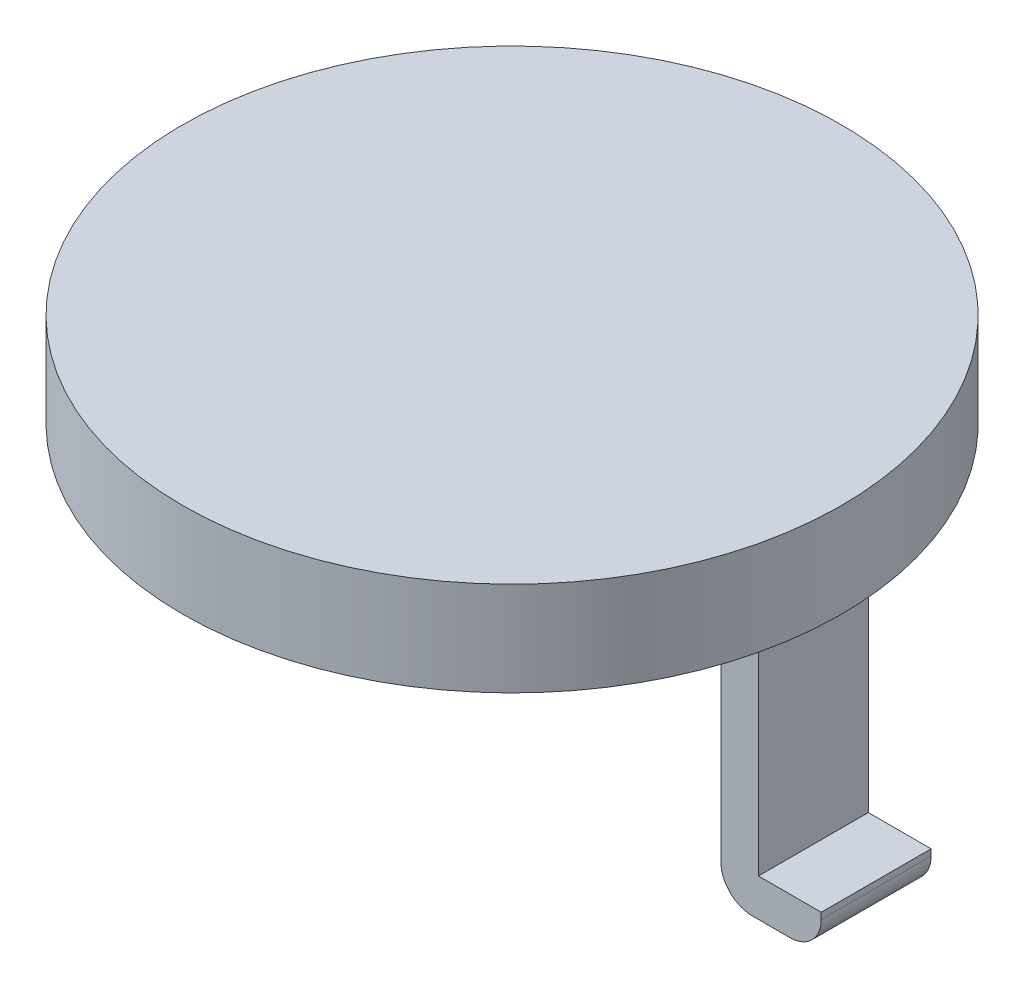
ISO-10303-21;
HEADER;
FILE_DESCRIPTION(('STEP AP214'),'2;1');
FILE_NAME('part.step','',(''),(''),'','','');
FILE_SCHEMA(('AUTOMOTIVE_DESIGN { 1 0 10303 214 1 1 1 1 }'));
ENDSEC;
DATA;
#1=APPLICATION_CONTEXT('core data for automotive mechanical design processes');
#2=APPLICATION_PROTOCOL_DEFINITION('international standard','automotive_design',2000,#1);
#3=PRODUCT_CONTEXT('',#1,'mechanical');
#4=PRODUCT('Part','Part','',(#3));
#5=PRODUCT_RELATED_PRODUCT_CATEGORY('part','',(#4));
#6=PRODUCT_DEFINITION_FORMATION('','',#4);
#7=PRODUCT_DEFINITION_CONTEXT('part definition',#1,'design');
#8=PRODUCT_DEFINITION('design','',#6,#7);
#9=PRODUCT_DEFINITION_SHAPE('','',#8);
#10=(LENGTH_UNIT() NAMED_UNIT(*) SI_UNIT(.MILLI.,.METRE.));
#11=(NAMED_UNIT(*) PLANE_ANGLE_UNIT() SI_UNIT($,.RADIAN.));
#12=(NAMED_UNIT(*) SI_UNIT($,.STERADIAN.) SOLID_ANGLE_UNIT());
#13=UNCERTAINTY_MEASURE_WITH_UNIT(LENGTH_MEASURE(1.E-05),#10,'distance_accuracy_value','');
#14=(GEOMETRIC_REPRESENTATION_CONTEXT(3) GLOBAL_UNCERTAINTY_ASSIGNED_CONTEXT((#13)) GLOBAL_UNIT_ASSIGNED_CONTEXT((#10,
#11,#12)) REPRESENTATION_CONTEXT('',''));
#15=CARTESIAN_POINT('',(0.,0.,0.));
#16=DIRECTION('',(0.,0.,1.));
#17=DIRECTION('',(1.,0.,0.));
#18=AXIS2_PLACEMENT_3D('',#15,#16,#17);
#19=CARTESIAN_POINT('',(0.,0.,0.));
#20=DIRECTION('',(0.,1.,0.));
#21=DIRECTION('',(0.,0.,1.));
#22=AXIS2_PLACEMENT_3D('',#19,#20,#21);
#23=PLANE('',#22);
#24=CARTESIAN_POINT('',(0.,0.,0.));
#25=DIRECTION('',(0.,1.,0.));
#26=DIRECTION('',(0.,0.,1.));
#27=AXIS2_PLACEMENT_3D('',#24,#25,#26);
#28=CIRCLE('',#27,10.5);
#29=CARTESIAN_POINT('',(0.,0.,10.5));
#30=VERTEX_POINT('',#29);
#31=EDGE_CURVE('E269',#30,#30,#28,.T.);
#32=ORIENTED_EDGE('',*,*,#31,.F.);
#33=EDGE_LOOP('',(#32));
#34=FACE_BOUND('',#33,.T.);
#35=DIRECTION('',(1.,0.,0.));
#36=VECTOR('',#35,1.);
#37=CARTESIAN_POINT('',(-9.6,0.,-1.75));
#38=LINE('',#37,#36);
#39=CARTESIAN_POINT('',(-9.6,0.,-1.75));
#40=VERTEX_POINT('',#39);
#41=CARTESIAN_POINT('',(-8.4,0.,-1.75));
#42=VERTEX_POINT('',#41);
#43=EDGE_CURVE('E247',#40,#42,#38,.T.);
#44=ORIENTED_EDGE('',*,*,#43,.F.);
#45=DIRECTION('',(0.,0.,1.));
#46=VECTOR('',#45,1.);
#47=CARTESIAN_POINT('',(-9.6,0.,-1.75));
#48=LINE('',#47,#46);
#49=CARTESIAN_POINT('',(-9.6,0.,1.75));
#50=VERTEX_POINT('',#49);
#51=EDGE_CURVE('E241',#40,#50,#48,.T.);
#52=ORIENTED_EDGE('',*,*,#51,.T.);
#53=DIRECTION('',(1.,0.,0.));
#54=VECTOR('',#53,1.);
#55=CARTESIAN_POINT('',(-9.6,0.,1.75));
#56=LINE('',#55,#54);
#57=CARTESIAN_POINT('',(-8.4,0.,1.75));
#58=VERTEX_POINT('',#57);
#59=EDGE_CURVE('E255',#50,#58,#56,.T.);
#60=ORIENTED_EDGE('',*,*,#59,.T.);
#61=DIRECTION('',(0.,0.,1.));
#62=VECTOR('',#61,1.);
#63=CARTESIAN_POINT('',(-8.4,0.,-1.75));
#64=LINE('',#63,#62);
#65=EDGE_CURVE('E259',#42,#58,#64,.T.);
#66=ORIENTED_EDGE('',*,*,#65,.F.);
#67=EDGE_LOOP('',(#44,#52,#60,#66));
#68=FACE_BOUND('',#67,.T.);
#69=DIRECTION('',(0.,0.,1.));
#70=VECTOR('',#69,1.);
#71=CARTESIAN_POINT('',(9.6,0.,-1.75));
#72=LINE('',#71,#70);
#73=CARTESIAN_POINT('',(9.6,0.,-1.75));
#74=VERTEX_POINT('',#73);
#75=CARTESIAN_POINT('',(9.6,0.,1.75));
#76=VERTEX_POINT('',#75);
#77=EDGE_CURVE('E165',#74,#76,#72,.T.);
#78=ORIENTED_EDGE('',*,*,#77,.F.);
#79=DIRECTION('',(-1.,0.,0.));
#80=VECTOR('',#79,1.);
#81=CARTESIAN_POINT('',(9.6,0.,-1.75));
#82=LINE('',#81,#80);
#83=CARTESIAN_POINT('',(8.4,0.,-1.75));
#84=VERTEX_POINT('',#83);
#85=EDGE_CURVE('E197',#74,#84,#82,.T.);
#86=ORIENTED_EDGE('',*,*,#85,.T.);
#87=DIRECTION('',(0.,0.,1.));
#88=VECTOR('',#87,1.);
#89=CARTESIAN_POINT('',(8.4,0.,-1.75));
#90=LINE('',#89,#88);
#91=CARTESIAN_POINT('',(8.4,0.,1.75));
#92=VERTEX_POINT('',#91);
#93=EDGE_CURVE('E201',#84,#92,#90,.T.);
#94=ORIENTED_EDGE('',*,*,#93,.T.);
#95=DIRECTION('',(-1.,0.,0.));
#96=VECTOR('',#95,1.);
#97=CARTESIAN_POINT('',(9.6,0.,1.75));
#98=LINE('',#97,#96);
#99=EDGE_CURVE('E190',#76,#92,#98,.T.);
#100=ORIENTED_EDGE('',*,*,#99,.F.);
#101=EDGE_LOOP('',(#78,#86,#94,#100));
#102=FACE_BOUND('',#101,.T.);
#103=ADVANCED_FACE('F39',(#34,#68,#102),#23,.F.);
#104=CARTESIAN_POINT('',(-9.6,-8.,-1.75));
#105=DIRECTION('',(-1.,0.,0.));
#106=DIRECTION('',(0.,0.,1.));
#107=AXIS2_PLACEMENT_3D('',#104,#105,#106);
#108=PLANE('',#107);
#109=DIRECTION('',(0.,1.,0.));
#110=VECTOR('',#109,1.);
#111=CARTESIAN_POINT('',(-9.6,-8.,-1.75));
#112=LINE('',#111,#110);
#113=CARTESIAN_POINT('',(-9.6,-6.8,-1.75));
#114=VERTEX_POINT('',#113);
#115=EDGE_CURVE('E266',#114,#40,#112,.T.);
#116=ORIENTED_EDGE('',*,*,#115,.F.);
#117=DIRECTION('',(0.,0.,-1.));
#118=VECTOR('',#117,1.);
#119=CARTESIAN_POINT('',(-9.6,-6.8,-1.75));
#120=LINE('',#119,#118);
#121=CARTESIAN_POINT('',(-9.6,-6.8,1.75));
#122=VERTEX_POINT('',#121);
#123=EDGE_CURVE('E211',#122,#114,#120,.T.);
#124=ORIENTED_EDGE('',*,*,#123,.F.);
#125=DIRECTION('',(0.,1.,0.));
#126=VECTOR('',#125,1.);
#127=CARTESIAN_POINT('',(-9.6,-8.,1.75));
#128=LINE('',#127,#126);
#129=EDGE_CURVE('E251',#122,#50,#128,.T.);
#130=ORIENTED_EDGE('',*,*,#129,.T.);
#131=ORIENTED_EDGE('',*,*,#51,.F.);
#132=EDGE_LOOP('',(#116,#124,#130,#131));
#133=FACE_BOUND('',#132,.T.);
#134=ADVANCED_FACE('F364',(#133),#108,.T.);
#135=CARTESIAN_POINT('',(0.,3.,0.));
#136=DIRECTION('',(0.,-1.,0.));
#137=DIRECTION('',(0.,0.,-1.));
#138=AXIS2_PLACEMENT_3D('',#135,#136,#137);
#139=CYLINDRICAL_SURFACE('',#138,10.5);
#140=CARTESIAN_POINT('',(0.,3.,0.));
#141=DIRECTION('',(0.,1.,0.));
#142=DIRECTION('',(0.,0.,1.));
#143=AXIS2_PLACEMENT_3D('',#140,#141,#142);
#144=CIRCLE('',#143,10.5);
#145=CARTESIAN_POINT('',(0.,3.,10.5));
#146=VERTEX_POINT('',#145);
#147=EDGE_CURVE('E278',#146,#146,#144,.T.);
#148=ORIENTED_EDGE('',*,*,#147,.F.);
#149=EDGE_LOOP('',(#148));
#150=FACE_BOUND('',#149,.T.);
#151=ORIENTED_EDGE('',*,*,#31,.T.);
#152=EDGE_LOOP('',(#151));
#153=FACE_BOUND('',#152,.T.);
#154=ADVANCED_FACE('F370',(#150,#153),#139,.T.);
#155=CARTESIAN_POINT('',(0.,3.,0.));
#156=DIRECTION('',(0.,1.,0.));
#157=DIRECTION('',(0.,0.,1.));
#158=AXIS2_PLACEMENT_3D('',#155,#156,#157);
#159=PLANE('',#158);
#160=ORIENTED_EDGE('',*,*,#147,.T.);
#161=EDGE_LOOP('',(#160));
#162=FACE_BOUND('',#161,.T.);
#163=ADVANCED_FACE('F377',(#162),#159,.T.);
#164=CARTESIAN_POINT('',(-9.6,-8.,-1.75));
#165=DIRECTION('',(0.,0.,1.));
#166=DIRECTION('',(1.,0.,0.));
#167=AXIS2_PLACEMENT_3D('',#164,#165,#166);
#168=PLANE('',#167);
#169=DIRECTION('',(1.,0.,0.));
#170=VECTOR('',#169,1.);
#171=CARTESIAN_POINT('',(-9.6,-8.,-1.75));
#172=LINE('',#171,#170);
#173=CARTESIAN_POINT('',(-10.6,-8.,-1.75));
#174=VERTEX_POINT('',#173);
#175=CARTESIAN_POINT('',(-9.4,-8.,-1.75));
#176=VERTEX_POINT('',#175);
#177=EDGE_CURVE('E246',#174,#176,#172,.T.);
#178=ORIENTED_EDGE('',*,*,#177,.F.);
#179=CARTESIAN_POINT('',(-10.6,-7.,-1.75));
#180=DIRECTION('',(0.,0.,1.));
#181=DIRECTION('',(1.,0.,0.));
#182=AXIS2_PLACEMENT_3D('',#179,#180,#181);
#183=CIRCLE('',#182,1.);
#184=CARTESIAN_POINT('',(-11.6,-7.,-1.75));
#185=VERTEX_POINT('',#184);
#186=EDGE_CURVE('E305',#174,#185,#183,.F.);
#187=ORIENTED_EDGE('',*,*,#186,.T.);
#188=DIRECTION('',(0.,-1.,0.));
#189=VECTOR('',#188,1.);
#190=CARTESIAN_POINT('',(-11.6,-8.,-1.75));
#191=LINE('',#190,#189);
#192=CARTESIAN_POINT('',(-11.6,-6.8,-1.75));
#193=VERTEX_POINT('',#192);
#194=EDGE_CURVE('E220',#193,#185,#191,.T.);
#195=ORIENTED_EDGE('',*,*,#194,.F.);
#196=DIRECTION('',(1.,0.,0.));
#197=VECTOR('',#196,1.);
#198=CARTESIAN_POINT('',(-11.6,-6.8,-1.75));
#199=LINE('',#198,#197);
#200=EDGE_CURVE('E230',#193,#114,#199,.T.);
#201=ORIENTED_EDGE('',*,*,#200,.T.);
#202=ORIENTED_EDGE('',*,*,#115,.T.);
#203=ORIENTED_EDGE('',*,*,#43,.T.);
#204=DIRECTION('',(0.,1.,0.));
#205=VECTOR('',#204,1.);
#206=CARTESIAN_POINT('',(-8.4,-8.,-1.75));
#207=LINE('',#206,#205);
#208=CARTESIAN_POINT('',(-8.4,-7.,-1.75));
#209=VERTEX_POINT('',#208);
#210=EDGE_CURVE('E270',#209,#42,#207,.T.);
#211=ORIENTED_EDGE('',*,*,#210,.F.);
#212=CARTESIAN_POINT('',(-9.4,-7.,-1.75));
#213=DIRECTION('',(0.,0.,1.));
#214=DIRECTION('',(1.,0.,0.));
#215=AXIS2_PLACEMENT_3D('',#212,#213,#214);
#216=CIRCLE('',#215,1.);
#217=EDGE_CURVE('E302',#209,#176,#216,.F.);
#218=ORIENTED_EDGE('',*,*,#217,.T.);
#219=EDGE_LOOP('',(#178,#187,#195,#201,#202,#203,#211,#218));
#220=FACE_BOUND('',#219,.T.);
#221=ADVANCED_FACE('F512',(#220),#168,.F.);
#222=CARTESIAN_POINT('',(-8.4,-8.,-1.75));
#223=DIRECTION('',(-1.,0.,0.));
#224=DIRECTION('',(0.,0.,1.));
#225=AXIS2_PLACEMENT_3D('',#222,#223,#224);
#226=PLANE('',#225);
#227=DIRECTION('',(0.,1.,0.));
#228=VECTOR('',#227,1.);
#229=CARTESIAN_POINT('',(-8.4,-8.,1.75));
#230=LINE('',#229,#228);
#231=CARTESIAN_POINT('',(-8.4,-7.,1.75));
#232=VERTEX_POINT('',#231);
#233=EDGE_CURVE('E273',#232,#58,#230,.T.);
#234=ORIENTED_EDGE('',*,*,#233,.F.);
#235=DIRECTION('',(0.,0.,1.));
#236=VECTOR('',#235,1.);
#237=CARTESIAN_POINT('',(-8.4,-7.,-1.75));
#238=LINE('',#237,#236);
#239=EDGE_CURVE('E308',#232,#209,#238,.F.);
#240=ORIENTED_EDGE('',*,*,#239,.T.);
#241=ORIENTED_EDGE('',*,*,#210,.T.);
#242=ORIENTED_EDGE('',*,*,#65,.T.);
#243=EDGE_LOOP('',(#234,#240,#241,#242));
#244=FACE_BOUND('',#243,.T.);
#245=ADVANCED_FACE('F500',(#244),#226,.F.);
#246=CARTESIAN_POINT('',(-9.6,-8.,1.75));
#247=DIRECTION('',(0.,0.,1.));
#248=DIRECTION('',(1.,0.,0.));
#249=AXIS2_PLACEMENT_3D('',#246,#247,#248);
#250=PLANE('',#249);
#251=DIRECTION('',(0.,1.,0.));
#252=VECTOR('',#251,1.);
#253=CARTESIAN_POINT('',(-11.6,-8.,1.75));
#254=LINE('',#253,#252);
#255=CARTESIAN_POINT('',(-11.6,-7.,1.75));
#256=VERTEX_POINT('',#255);
#257=CARTESIAN_POINT('',(-11.6,-6.8,1.75));
#258=VERTEX_POINT('',#257);
#259=EDGE_CURVE('E224',#256,#258,#254,.T.);
#260=ORIENTED_EDGE('',*,*,#259,.F.);
#261=CARTESIAN_POINT('',(-10.6,-7.,1.75));
#262=DIRECTION('',(0.,0.,1.));
#263=DIRECTION('',(1.,0.,0.));
#264=AXIS2_PLACEMENT_3D('',#261,#262,#263);
#265=CIRCLE('',#264,1.);
#266=CARTESIAN_POINT('',(-10.6,-8.,1.75));
#267=VERTEX_POINT('',#266);
#268=EDGE_CURVE('E292',#256,#267,#265,.T.);
#269=ORIENTED_EDGE('',*,*,#268,.T.);
#270=DIRECTION('',(1.,0.,0.));
#271=VECTOR('',#270,1.);
#272=CARTESIAN_POINT('',(-9.6,-8.,1.75));
#273=LINE('',#272,#271);
#274=CARTESIAN_POINT('',(-9.4,-8.,1.75));
#275=VERTEX_POINT('',#274);
#276=EDGE_CURVE('E242',#267,#275,#273,.T.);
#277=ORIENTED_EDGE('',*,*,#276,.T.);
#278=CARTESIAN_POINT('',(-9.4,-7.,1.75));
#279=DIRECTION('',(0.,0.,1.));
#280=DIRECTION('',(1.,0.,0.));
#281=AXIS2_PLACEMENT_3D('',#278,#279,#280);
#282=CIRCLE('',#281,1.);
#283=EDGE_CURVE('E289',#275,#232,#282,.T.);
#284=ORIENTED_EDGE('',*,*,#283,.T.);
#285=ORIENTED_EDGE('',*,*,#233,.T.);
#286=ORIENTED_EDGE('',*,*,#59,.F.);
#287=ORIENTED_EDGE('',*,*,#129,.F.);
#288=DIRECTION('',(1.,0.,0.));
#289=VECTOR('',#288,1.);
#290=CARTESIAN_POINT('',(-11.6,-6.8,1.75));
#291=LINE('',#290,#289);
#292=EDGE_CURVE('E237',#258,#122,#291,.T.);
#293=ORIENTED_EDGE('',*,*,#292,.F.);
#294=EDGE_LOOP('',(#260,#269,#277,#284,#285,#286,#287,#293));
#295=FACE_BOUND('',#294,.T.);
#296=ADVANCED_FACE('F489',(#295),#250,.T.);
#297=CARTESIAN_POINT('',(0.,-8.,0.));
#298=DIRECTION('',(0.,1.,0.));
#299=DIRECTION('',(0.,0.,1.));
#300=AXIS2_PLACEMENT_3D('',#297,#298,#299);
#301=PLANE('',#300);
#302=ORIENTED_EDGE('',*,*,#276,.F.);
#303=DIRECTION('',(0.,0.,1.));
#304=VECTOR('',#303,1.);
#305=CARTESIAN_POINT('',(-10.6,-8.,0.));
#306=LINE('',#305,#304);
#307=EDGE_CURVE('E299',#267,#174,#306,.F.);
#308=ORIENTED_EDGE('',*,*,#307,.T.);
#309=ORIENTED_EDGE('',*,*,#177,.T.);
#310=DIRECTION('',(0.,0.,1.));
#311=VECTOR('',#310,1.);
#312=CARTESIAN_POINT('',(-9.4,-8.,0.));
#313=LINE('',#312,#311);
#314=EDGE_CURVE('E295',#176,#275,#313,.T.);
#315=ORIENTED_EDGE('',*,*,#314,.T.);
#316=EDGE_LOOP('',(#302,#308,#309,#315));
#317=FACE_BOUND('',#316,.T.);
#318=ADVANCED_FACE('F484',(#317),#301,.F.);
#319=CARTESIAN_POINT('',(-11.6,-6.8,-1.75));
#320=DIRECTION('',(0.,-1.,0.));
#321=DIRECTION('',(0.,0.,-1.));
#322=AXIS2_PLACEMENT_3D('',#319,#320,#321);
#323=PLANE('',#322);
#324=ORIENTED_EDGE('',*,*,#123,.T.);
#325=ORIENTED_EDGE('',*,*,#200,.F.);
#326=DIRECTION('',(0.,0.,-1.));
#327=VECTOR('',#326,1.);
#328=CARTESIAN_POINT('',(-11.6,-6.8,-1.75));
#329=LINE('',#328,#327);
#330=EDGE_CURVE('E227',#258,#193,#329,.T.);
#331=ORIENTED_EDGE('',*,*,#330,.F.);
#332=ORIENTED_EDGE('',*,*,#292,.T.);
#333=EDGE_LOOP('',(#324,#325,#331,#332));
#334=FACE_BOUND('',#333,.T.);
#335=ADVANCED_FACE('F477',(#334),#323,.F.);
#336=CARTESIAN_POINT('',(-11.6,0.,0.));
#337=DIRECTION('',(1.,0.,0.));
#338=DIRECTION('',(0.,0.,-1.));
#339=AXIS2_PLACEMENT_3D('',#336,#337,#338);
#340=PLANE('',#339);
#341=ORIENTED_EDGE('',*,*,#194,.T.);
#342=DIRECTION('',(0.,0.,1.));
#343=VECTOR('',#342,1.);
#344=CARTESIAN_POINT('',(-11.6,-7.,0.));
#345=LINE('',#344,#343);
#346=EDGE_CURVE('E282',#185,#256,#345,.T.);
#347=ORIENTED_EDGE('',*,*,#346,.T.);
#348=ORIENTED_EDGE('',*,*,#259,.T.);
#349=ORIENTED_EDGE('',*,*,#330,.T.);
#350=EDGE_LOOP('',(#341,#347,#348,#349));
#351=FACE_BOUND('',#350,.T.);
#352=ADVANCED_FACE('F382',(#351),#340,.F.);
#353=CARTESIAN_POINT('',(-10.6,-7.,0.));
#354=DIRECTION('',(0.,0.,1.));
#355=DIRECTION('',(1.,0.,0.));
#356=AXIS2_PLACEMENT_3D('',#353,#354,#355);
#357=CYLINDRICAL_SURFACE('',#356,1.);
#358=ORIENTED_EDGE('',*,*,#186,.F.);
#359=ORIENTED_EDGE('',*,*,#307,.F.);
#360=ORIENTED_EDGE('',*,*,#268,.F.);
#361=ORIENTED_EDGE('',*,*,#346,.F.);
#362=EDGE_LOOP('',(#358,#359,#360,#361));
#363=FACE_BOUND('',#362,.T.);
#364=ADVANCED_FACE('F358',(#363),#357,.T.);
#365=CARTESIAN_POINT('',(-9.4,-7.,0.));
#366=DIRECTION('',(0.,0.,1.));
#367=DIRECTION('',(1.,0.,0.));
#368=AXIS2_PLACEMENT_3D('',#365,#366,#367);
#369=CYLINDRICAL_SURFACE('',#368,1.);
#370=ORIENTED_EDGE('',*,*,#217,.F.);
#371=ORIENTED_EDGE('',*,*,#239,.F.);
#372=ORIENTED_EDGE('',*,*,#283,.F.);
#373=ORIENTED_EDGE('',*,*,#314,.F.);
#374=EDGE_LOOP('',(#370,#371,#372,#373));
#375=FACE_BOUND('',#374,.T.);
#376=ADVANCED_FACE('F351',(#375),#369,.T.);
#377=CARTESIAN_POINT('',(9.6,-8.,-1.75));
#378=DIRECTION('',(-1.,0.,0.));
#379=DIRECTION('',(0.,0.,1.));
#380=AXIS2_PLACEMENT_3D('',#377,#378,#379);
#381=PLANE('',#380);
#382=DIRECTION('',(0.,1.,0.));
#383=VECTOR('',#382,1.);
#384=CARTESIAN_POINT('',(9.6,-8.,1.75));
#385=LINE('',#384,#383);
#386=CARTESIAN_POINT('',(9.6,-6.8,1.75));
#387=VERTEX_POINT('',#386);
#388=EDGE_CURVE('E208',#387,#76,#385,.T.);
#389=ORIENTED_EDGE('',*,*,#388,.F.);
#390=DIRECTION('',(0.,0.,-1.));
#391=VECTOR('',#390,1.);
#392=CARTESIAN_POINT('',(9.6,-6.8,-1.75));
#393=LINE('',#392,#391);
#394=CARTESIAN_POINT('',(9.6,-6.8,-1.75));
#395=VERTEX_POINT('',#394);
#396=EDGE_CURVE('E172',#387,#395,#393,.T.);
#397=ORIENTED_EDGE('',*,*,#396,.T.);
#398=DIRECTION('',(0.,1.,0.));
#399=VECTOR('',#398,1.);
#400=CARTESIAN_POINT('',(9.6,-8.,-1.75));
#401=LINE('',#400,#399);
#402=EDGE_CURVE('E159',#395,#74,#401,.T.);
#403=ORIENTED_EDGE('',*,*,#402,.T.);
#404=ORIENTED_EDGE('',*,*,#77,.T.);
#405=EDGE_LOOP('',(#389,#397,#403,#404));
#406=FACE_BOUND('',#405,.T.);
#407=ADVANCED_FACE('F349',(#406),#381,.F.);
#408=CARTESIAN_POINT('',(9.6,-8.,1.75));
#409=DIRECTION('',(0.,0.,-1.));
#410=DIRECTION('',(-1.,0.,0.));
#411=AXIS2_PLACEMENT_3D('',#408,#409,#410);
#412=PLANE('',#411);
#413=DIRECTION('',(-1.,0.,0.));
#414=VECTOR('',#413,1.);
#415=CARTESIAN_POINT('',(9.6,-8.,1.75));
#416=LINE('',#415,#414);
#417=CARTESIAN_POINT('',(10.6,-8.,1.75));
#418=VERTEX_POINT('',#417);
#419=CARTESIAN_POINT('',(9.4,-8.,1.75));
#420=VERTEX_POINT('',#419);
#421=EDGE_CURVE('E189',#418,#420,#416,.T.);
#422=ORIENTED_EDGE('',*,*,#421,.F.);
#423=CARTESIAN_POINT('',(10.6,-7.,1.75));
#424=DIRECTION('',(0.,0.,-1.));
#425=DIRECTION('',(-1.,0.,0.));
#426=AXIS2_PLACEMENT_3D('',#423,#424,#425);
#427=CIRCLE('',#426,1.);
#428=CARTESIAN_POINT('',(11.6,-7.,1.75));
#429=VERTEX_POINT('',#428);
#430=EDGE_CURVE('E321',#418,#429,#427,.F.);
#431=ORIENTED_EDGE('',*,*,#430,.T.);
#432=DIRECTION('',(0.,1.,0.));
#433=VECTOR('',#432,1.);
#434=CARTESIAN_POINT('',(11.6,-8.,1.75));
#435=LINE('',#434,#433);
#436=CARTESIAN_POINT('',(11.6,-6.8,1.75));
#437=VERTEX_POINT('',#436);
#438=EDGE_CURVE('E177',#429,#437,#435,.T.);
#439=ORIENTED_EDGE('',*,*,#438,.T.);
#440=DIRECTION('',(-1.,0.,0.));
#441=VECTOR('',#440,1.);
#442=CARTESIAN_POINT('',(11.6,-6.8,1.75));
#443=LINE('',#442,#441);
#444=EDGE_CURVE('E166',#437,#387,#443,.T.);
#445=ORIENTED_EDGE('',*,*,#444,.T.);
#446=ORIENTED_EDGE('',*,*,#388,.T.);
#447=ORIENTED_EDGE('',*,*,#99,.T.);
#448=DIRECTION('',(0.,1.,0.));
#449=VECTOR('',#448,1.);
#450=CARTESIAN_POINT('',(8.4,-8.,1.75));
#451=LINE('',#450,#449);
#452=CARTESIAN_POINT('',(8.4,-7.,1.75));
#453=VERTEX_POINT('',#452);
#454=EDGE_CURVE('E212',#453,#92,#451,.T.);
#455=ORIENTED_EDGE('',*,*,#454,.F.);
#456=CARTESIAN_POINT('',(9.4,-7.,1.75));
#457=DIRECTION('',(0.,0.,-1.));
#458=DIRECTION('',(-1.,0.,0.));
#459=AXIS2_PLACEMENT_3D('',#456,#457,#458);
#460=CIRCLE('',#459,1.);
#461=EDGE_CURVE('E318',#453,#420,#460,.F.);
#462=ORIENTED_EDGE('',*,*,#461,.T.);
#463=EDGE_LOOP('',(#422,#431,#439,#445,#446,#447,#455,#462));
#464=FACE_BOUND('',#463,.T.);
#465=ADVANCED_FACE('F337',(#464),#412,.F.);
#466=CARTESIAN_POINT('',(8.4,-8.,-1.75));
#467=DIRECTION('',(-1.,0.,0.));
#468=DIRECTION('',(0.,0.,1.));
#469=AXIS2_PLACEMENT_3D('',#466,#467,#468);
#470=PLANE('',#469);
#471=DIRECTION('',(0.,1.,0.));
#472=VECTOR('',#471,1.);
#473=CARTESIAN_POINT('',(8.4,-8.,-1.75));
#474=LINE('',#473,#472);
#475=CARTESIAN_POINT('',(8.4,-7.,-1.75));
#476=VERTEX_POINT('',#475);
#477=EDGE_CURVE('E215',#476,#84,#474,.T.);
#478=ORIENTED_EDGE('',*,*,#477,.F.);
#479=DIRECTION('',(0.,0.,1.));
#480=VECTOR('',#479,1.);
#481=CARTESIAN_POINT('',(8.4,-7.,1.75));
#482=LINE('',#481,#480);
#483=EDGE_CURVE('E11',#476,#453,#482,.T.);
#484=ORIENTED_EDGE('',*,*,#483,.T.);
#485=ORIENTED_EDGE('',*,*,#454,.T.);
#486=ORIENTED_EDGE('',*,*,#93,.F.);
#487=EDGE_LOOP('',(#478,#484,#485,#486));
#488=FACE_BOUND('',#487,.T.);
#489=ADVANCED_FACE('F342',(#488),#470,.T.);
#490=CARTESIAN_POINT('',(9.6,-8.,-1.75));
#491=DIRECTION('',(0.,0.,-1.));
#492=DIRECTION('',(-1.,0.,0.));
#493=AXIS2_PLACEMENT_3D('',#490,#491,#492);
#494=PLANE('',#493);
#495=DIRECTION('',(0.,-1.,0.));
#496=VECTOR('',#495,1.);
#497=CARTESIAN_POINT('',(11.6,-8.,-1.75));
#498=LINE('',#497,#496);
#499=CARTESIAN_POINT('',(11.6,-6.8,-1.75));
#500=VERTEX_POINT('',#499);
#501=CARTESIAN_POINT('',(11.6,-7.,-1.75));
#502=VERTEX_POINT('',#501);
#503=EDGE_CURVE('E156',#500,#502,#498,.T.);
#504=ORIENTED_EDGE('',*,*,#503,.T.);
#505=CARTESIAN_POINT('',(10.6,-7.,-1.75));
#506=DIRECTION('',(0.,0.,-1.));
#507=DIRECTION('',(-1.,0.,0.));
#508=AXIS2_PLACEMENT_3D('',#505,#506,#507);
#509=CIRCLE('',#508,1.);
#510=CARTESIAN_POINT('',(10.6,-8.,-1.75));
#511=VERTEX_POINT('',#510);
#512=EDGE_CURVE('E48',#502,#511,#509,.T.);
#513=ORIENTED_EDGE('',*,*,#512,.T.);
#514=DIRECTION('',(-1.,0.,0.));
#515=VECTOR('',#514,1.);
#516=CARTESIAN_POINT('',(9.6,-8.,-1.75));
#517=LINE('',#516,#515);
#518=CARTESIAN_POINT('',(9.4,-8.,-1.75));
#519=VERTEX_POINT('',#518);
#520=EDGE_CURVE('E186',#511,#519,#517,.T.);
#521=ORIENTED_EDGE('',*,*,#520,.T.);
#522=CARTESIAN_POINT('',(9.4,-7.,-1.75));
#523=DIRECTION('',(0.,0.,-1.));
#524=DIRECTION('',(-1.,0.,0.));
#525=AXIS2_PLACEMENT_3D('',#522,#523,#524);
#526=CIRCLE('',#525,1.);
#527=EDGE_CURVE('E55',#519,#476,#526,.T.);
#528=ORIENTED_EDGE('',*,*,#527,.T.);
#529=ORIENTED_EDGE('',*,*,#477,.T.);
#530=ORIENTED_EDGE('',*,*,#85,.F.);
#531=ORIENTED_EDGE('',*,*,#402,.F.);
#532=DIRECTION('',(-1.,0.,0.));
#533=VECTOR('',#532,1.);
#534=CARTESIAN_POINT('',(11.6,-6.8,-1.75));
#535=LINE('',#534,#533);
#536=EDGE_CURVE('E154',#500,#395,#535,.T.);
#537=ORIENTED_EDGE('',*,*,#536,.F.);
#538=EDGE_LOOP('',(#504,#513,#521,#528,#529,#530,#531,#537));
#539=FACE_BOUND('',#538,.T.);
#540=ADVANCED_FACE('F155',(#539),#494,.T.);
#541=CARTESIAN_POINT('',(0.,-8.,0.));
#542=DIRECTION('',(0.,1.,0.));
#543=DIRECTION('',(0.,0.,1.));
#544=AXIS2_PLACEMENT_3D('',#541,#542,#543);
#545=PLANE('',#544);
#546=ORIENTED_EDGE('',*,*,#520,.F.);
#547=DIRECTION('',(0.,0.,1.));
#548=VECTOR('',#547,1.);
#549=CARTESIAN_POINT('',(10.6,-8.,0.));
#550=LINE('',#549,#548);
#551=EDGE_CURVE('E314',#511,#418,#550,.T.);
#552=ORIENTED_EDGE('',*,*,#551,.T.);
#553=ORIENTED_EDGE('',*,*,#421,.T.);
#554=DIRECTION('',(0.,0.,1.));
#555=VECTOR('',#554,1.);
#556=CARTESIAN_POINT('',(9.4,-8.,-1.75));
#557=LINE('',#556,#555);
#558=EDGE_CURVE('E311',#420,#519,#557,.F.);
#559=ORIENTED_EDGE('',*,*,#558,.T.);
#560=EDGE_LOOP('',(#546,#552,#553,#559));
#561=FACE_BOUND('',#560,.T.);
#562=ADVANCED_FACE('F332',(#561),#545,.F.);
#563=CARTESIAN_POINT('',(11.6,-6.8,-1.75));
#564=DIRECTION('',(0.,1.,0.));
#565=DIRECTION('',(0.,0.,1.));
#566=AXIS2_PLACEMENT_3D('',#563,#564,#565);
#567=PLANE('',#566);
#568=ORIENTED_EDGE('',*,*,#396,.F.);
#569=ORIENTED_EDGE('',*,*,#444,.F.);
#570=DIRECTION('',(0.,0.,-1.));
#571=VECTOR('',#570,1.);
#572=CARTESIAN_POINT('',(11.6,-6.8,-1.75));
#573=LINE('',#572,#571);
#574=EDGE_CURVE('E170',#437,#500,#573,.T.);
#575=ORIENTED_EDGE('',*,*,#574,.T.);
#576=ORIENTED_EDGE('',*,*,#536,.T.);
#577=EDGE_LOOP('',(#568,#569,#575,#576));
#578=FACE_BOUND('',#577,.T.);
#579=ADVANCED_FACE('F175',(#578),#567,.T.);
#580=CARTESIAN_POINT('',(11.6,0.,0.));
#581=DIRECTION('',(-1.,0.,0.));
#582=DIRECTION('',(0.,0.,-1.));
#583=AXIS2_PLACEMENT_3D('',#580,#581,#582);
#584=PLANE('',#583);
#585=ORIENTED_EDGE('',*,*,#438,.F.);
#586=DIRECTION('',(0.,0.,1.));
#587=VECTOR('',#586,1.);
#588=CARTESIAN_POINT('',(11.6,-7.,0.));
#589=LINE('',#588,#587);
#590=EDGE_CURVE('E63',#429,#502,#589,.F.);
#591=ORIENTED_EDGE('',*,*,#590,.T.);
#592=ORIENTED_EDGE('',*,*,#503,.F.);
#593=ORIENTED_EDGE('',*,*,#574,.F.);
#594=EDGE_LOOP('',(#585,#591,#592,#593));
#595=FACE_BOUND('',#594,.T.);
#596=ADVANCED_FACE('F169',(#595),#584,.F.);
#597=CARTESIAN_POINT('',(10.6,-7.,0.));
#598=DIRECTION('',(0.,0.,1.));
#599=DIRECTION('',(1.,0.,0.));
#600=AXIS2_PLACEMENT_3D('',#597,#598,#599);
#601=CYLINDRICAL_SURFACE('',#600,1.);
#602=ORIENTED_EDGE('',*,*,#512,.F.);
#603=ORIENTED_EDGE('',*,*,#590,.F.);
#604=ORIENTED_EDGE('',*,*,#430,.F.);
#605=ORIENTED_EDGE('',*,*,#551,.F.);
#606=EDGE_LOOP('',(#602,#603,#604,#605));
#607=FACE_BOUND('',#606,.T.);
#608=ADVANCED_FACE('F335',(#607),#601,.T.);
#609=CARTESIAN_POINT('',(9.4,-7.,-1.75));
#610=DIRECTION('',(0.,0.,-1.));
#611=DIRECTION('',(-1.,0.,0.));
#612=AXIS2_PLACEMENT_3D('',#609,#610,#611);
#613=CYLINDRICAL_SURFACE('',#612,1.);
#614=ORIENTED_EDGE('',*,*,#527,.F.);
#615=ORIENTED_EDGE('',*,*,#558,.F.);
#616=ORIENTED_EDGE('',*,*,#461,.F.);
#617=ORIENTED_EDGE('',*,*,#483,.F.);
#618=EDGE_LOOP('',(#614,#615,#616,#617));
#619=FACE_BOUND('',#618,.T.);
#620=ADVANCED_FACE('F41',(#619),#613,.T.);
#621=CLOSED_SHELL('',(#103,#134,#154,#163,#221,#245,#296,#318,#335,#352,#364,#376,#407,#465,
#489,#540,#562,#579,#596,#608,#620));
#622=MANIFOLD_SOLID_BREP('B2',#621);
#623=ADVANCED_BREP_SHAPE_REPRESENTATION('',(#18,#622),#14);
#624=SHAPE_DEFINITION_REPRESENTATION(#9,#623);
ENDSEC;
END-ISO-10303-21;
